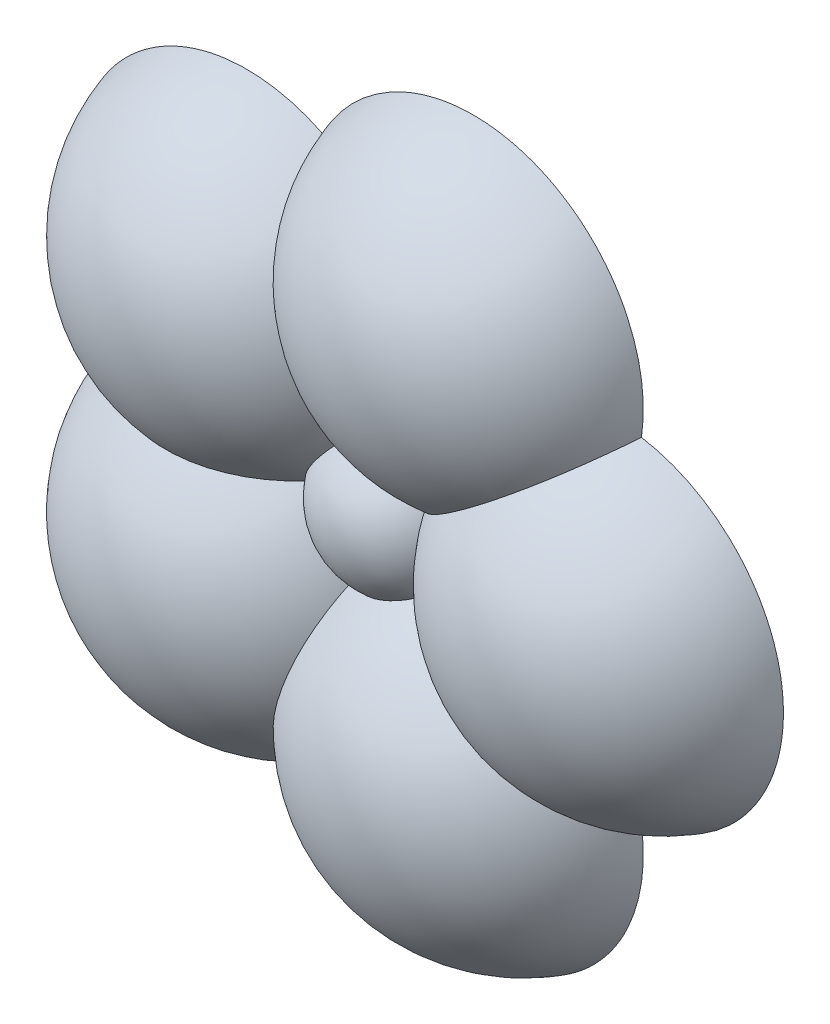
ISO-10303-21;
HEADER;
FILE_DESCRIPTION(('STEP AP214'),'2;1');
FILE_NAME('part.step','',(''),(''),'','','');
FILE_SCHEMA(('AUTOMOTIVE_DESIGN { 1 0 10303 214 1 1 1 1 }'));
ENDSEC;
DATA;
#1=APPLICATION_CONTEXT('core data for automotive mechanical design processes');
#2=APPLICATION_PROTOCOL_DEFINITION('international standard','automotive_design',2000,#1);
#3=PRODUCT_CONTEXT('',#1,'mechanical');
#4=PRODUCT('Part','Part','',(#3));
#5=PRODUCT_RELATED_PRODUCT_CATEGORY('part','',(#4));
#6=PRODUCT_DEFINITION_FORMATION('','',#4);
#7=PRODUCT_DEFINITION_CONTEXT('part definition',#1,'design');
#8=PRODUCT_DEFINITION('design','',#6,#7);
#9=PRODUCT_DEFINITION_SHAPE('','',#8);
#10=(LENGTH_UNIT() NAMED_UNIT(*) SI_UNIT(.MILLI.,.METRE.));
#11=(NAMED_UNIT(*) PLANE_ANGLE_UNIT() SI_UNIT($,.RADIAN.));
#12=(NAMED_UNIT(*) SI_UNIT($,.STERADIAN.) SOLID_ANGLE_UNIT());
#13=UNCERTAINTY_MEASURE_WITH_UNIT(LENGTH_MEASURE(1.E-05),#10,'distance_accuracy_value','');
#14=(GEOMETRIC_REPRESENTATION_CONTEXT(3) GLOBAL_UNCERTAINTY_ASSIGNED_CONTEXT((#13)) GLOBAL_UNIT_ASSIGNED_CONTEXT((#10,
#11,#12)) REPRESENTATION_CONTEXT('',''));
#15=CARTESIAN_POINT('',(0.,0.,0.));
#16=DIRECTION('',(0.,0.,1.));
#17=DIRECTION('',(1.,0.,0.));
#18=AXIS2_PLACEMENT_3D('',#15,#16,#17);
#19=CARTESIAN_POINT('',(0.,0.,1.));
#20=DIRECTION('',(1.,0.,0.));
#21=DIRECTION('',(0.,1.,0.));
#22=AXIS2_PLACEMENT_3D('',#19,#20,#21);
#23=SPHERICAL_SURFACE('',#22,1.5);
#24=CARTESIAN_POINT('',(0.823529411764706,0.,0.794117647058824));
#25=DIRECTION('',(-0.970142500145332,0.,0.242535625036333));
#26=DIRECTION('',(0.242535625036333,0.,0.970142500145332));
#27=AXIS2_PLACEMENT_3D('',#24,#25,#26);
#28=CIRCLE('',#27,1.23669388480169);
#29=CARTESIAN_POINT('',(1.05843313016408,0.76899668211404,1.73373252065632));
#30=VERTEX_POINT('',#29);
#31=CARTESIAN_POINT('',(1.05843313016408,-0.768996682114029,1.73373252065632));
#32=VERTEX_POINT('',#31);
#33=EDGE_CURVE('E178',#30,#32,#28,.F.);
#34=ORIENTED_EDGE('',*,*,#33,.F.);
#35=CARTESIAN_POINT('',(0.254484583602896,0.783223013419539,0.794117647058823));
#36=DIRECTION('',(-0.299790519510305,-0.922660346498091,0.242535625036333));
#37=DIRECTION('',(0.951056516295155,-0.309016994374945,0.));
#38=AXIS2_PLACEMENT_3D('',#35,#36,#37);
#39=CIRCLE('',#38,1.23669388480168);
#40=CARTESIAN_POINT('',(-0.404285480903742,1.24426276889641,1.73373252065632));
#41=VERTEX_POINT('',#40);
#42=EDGE_CURVE('E182',#41,#30,#39,.F.);
#43=ORIENTED_EDGE('',*,*,#42,.F.);
#44=CARTESIAN_POINT('',(-0.666249289485254,0.484058443064386,0.794117647058823));
#45=DIRECTION('',(0.784861769582977,-0.57023545420757,0.242535625036333));
#46=DIRECTION('',(0.587785252292468,0.809016994374951,0.));
#47=AXIS2_PLACEMENT_3D('',#44,#45,#46);
#48=CIRCLE('',#47,1.23669388480168);
#49=CARTESIAN_POINT('',(-1.30829529852069,0.,1.73373252065632));
#50=VERTEX_POINT('',#49);
#51=EDGE_CURVE('E186',#50,#41,#48,.F.);
#52=ORIENTED_EDGE('',*,*,#51,.F.);
#53=CARTESIAN_POINT('',(-0.666249289485247,-0.484058443064396,0.794117647058823));
#54=DIRECTION('',(0.784861769582968,0.570235454207581,0.242535625036333));
#55=DIRECTION('',(-0.58778525229248,0.809016994374942,0.));
#56=AXIS2_PLACEMENT_3D('',#53,#54,#55);
#57=CIRCLE('',#56,1.23669388480168);
#58=CARTESIAN_POINT('',(-0.404285480903724,-1.24426276889642,1.73373252065632));
#59=VERTEX_POINT('',#58);
#60=EDGE_CURVE('E69',#59,#50,#57,.F.);
#61=ORIENTED_EDGE('',*,*,#60,.F.);
#62=CARTESIAN_POINT('',(0.254484583602907,-0.783223013419535,0.794117647058823));
#63=DIRECTION('',(-0.299790519510318,0.922660346498086,0.242535625036333));
#64=DIRECTION('',(-0.95105651629515,-0.309016994374958,0.));
#65=AXIS2_PLACEMENT_3D('',#62,#63,#64);
#66=CIRCLE('',#65,1.23669388480168);
#67=EDGE_CURVE('E192',#32,#59,#66,.F.);
#68=ORIENTED_EDGE('',*,*,#67,.F.);
#69=EDGE_LOOP('',(#34,#43,#52,#61,#68));
#70=FACE_BOUND('',#69,.T.);
#71=ADVANCED_FACE('F52',(#70),#23,.T.);
#72=CARTESIAN_POINT('',(4.,0.,0.));
#73=DIRECTION('',(1.,0.,0.));
#74=DIRECTION('',(0.,-1.,0.));
#75=AXIS2_PLACEMENT_3D('',#72,#73,#74);
#76=SPHERICAL_SURFACE('',#75,3.5);
#77=CARTESIAN_POINT('',(2.61803398874989,1.90211303259031,0.));
#78=DIRECTION('',(-0.587785252292474,0.809016994374947,0.));
#79=DIRECTION('',(-0.809016994374947,-0.587785252292474,0.));
#80=AXIS2_PLACEMENT_3D('',#77,#78,#79);
#81=CIRCLE('',#80,2.59270822789599);
#82=CARTESIAN_POINT('',(4.55328244944148,3.30815334153966,1.));
#83=VERTEX_POINT('',#82);
#84=EDGE_CURVE('E161',#30,#83,#81,.T.);
#85=ORIENTED_EDGE('',*,*,#84,.F.);
#86=ORIENTED_EDGE('',*,*,#33,.T.);
#87=CARTESIAN_POINT('',(2.61803398874992,-1.9021130325903,0.));
#88=DIRECTION('',(-0.587785252292468,-0.809016994374951,0.));
#89=DIRECTION('',(0.809016994374951,-0.587785252292468,0.));
#90=AXIS2_PLACEMENT_3D('',#87,#88,#89);
#91=CIRCLE('',#90,2.59270822789601);
#92=CARTESIAN_POINT('',(4.55328244944153,-3.30815334153965,1.));
#93=VERTEX_POINT('',#92);
#94=EDGE_CURVE('E149',#93,#32,#91,.T.);
#95=ORIENTED_EDGE('',*,*,#94,.F.);
#96=CARTESIAN_POINT('',(4.,0.,1.));
#97=DIRECTION('',(0.,0.,1.));
#98=DIRECTION('',(1.,0.,0.));
#99=AXIS2_PLACEMENT_3D('',#96,#97,#98);
#100=CIRCLE('',#99,3.35410196624968);
#101=EDGE_CURVE('E77',#83,#93,#100,.F.);
#102=ORIENTED_EDGE('',*,*,#101,.F.);
#103=EDGE_LOOP('',(#85,#86,#95,#102));
#104=FACE_BOUND('',#103,.T.);
#105=ADVANCED_FACE('F54',(#104),#76,.T.);
#106=CARTESIAN_POINT('',(1.23606797749978,3.80422606518062,0.));
#107=DIRECTION('',(0.309016994374945,0.951056516295155,0.));
#108=DIRECTION('',(0.951056516295155,-0.309016994374945,0.));
#109=AXIS2_PLACEMENT_3D('',#106,#107,#108);
#110=SPHERICAL_SURFACE('',#109,3.5);
#111=CARTESIAN_POINT('',(-1.00000000000001,3.07768353717525,0.));
#112=DIRECTION('',(-0.951056516295152,-0.309016994374952,0.));
#113=DIRECTION('',(0.309016994374952,-0.951056516295152,0.));
#114=AXIS2_PLACEMENT_3D('',#111,#112,#113);
#115=CIRCLE('',#114,2.59270822789599);
#116=CARTESIAN_POINT('',(-1.73919913530829,5.3527045466077,1.));
#117=VERTEX_POINT('',#116);
#118=EDGE_CURVE('E158',#41,#117,#115,.T.);
#119=ORIENTED_EDGE('',*,*,#118,.F.);
#120=ORIENTED_EDGE('',*,*,#42,.T.);
#121=ORIENTED_EDGE('',*,*,#84,.T.);
#122=CARTESIAN_POINT('',(1.23606797749978,3.80422606518062,1.));
#123=DIRECTION('',(0.,0.,1.));
#124=DIRECTION('',(1.,0.,0.));
#125=AXIS2_PLACEMENT_3D('',#122,#123,#124);
#126=CIRCLE('',#125,3.35410196624968);
#127=EDGE_CURVE('E168',#117,#83,#126,.F.);
#128=ORIENTED_EDGE('',*,*,#127,.F.);
#129=EDGE_LOOP('',(#119,#120,#121,#128));
#130=FACE_BOUND('',#129,.T.);
#131=ADVANCED_FACE('F229',(#130),#110,.T.);
#132=CARTESIAN_POINT('',(-3.2360679774998,2.35114100916987,0.));
#133=DIRECTION('',(-0.809016994374951,0.587785252292469,0.));
#134=DIRECTION('',(0.587785252292469,0.809016994374951,0.));
#135=AXIS2_PLACEMENT_3D('',#132,#133,#134);
#136=SPHERICAL_SURFACE('',#135,3.5);
#137=CARTESIAN_POINT('',(-3.23606797749979,0.,0.));
#138=DIRECTION('',(0.,-1.,0.));
#139=DIRECTION('',(1.,0.,0.));
#140=AXIS2_PLACEMENT_3D('',#137,#138,#139);
#141=CIRCLE('',#140,2.59270822789599);
#142=CARTESIAN_POINT('',(-5.62816662826642,0.,1.));
#143=VERTEX_POINT('',#142);
#144=EDGE_CURVE('E155',#50,#143,#141,.T.);
#145=ORIENTED_EDGE('',*,*,#144,.F.);
#146=ORIENTED_EDGE('',*,*,#51,.T.);
#147=ORIENTED_EDGE('',*,*,#118,.T.);
#148=CARTESIAN_POINT('',(-3.2360679774998,2.35114100916987,1.));
#149=DIRECTION('',(0.,0.,1.));
#150=DIRECTION('',(1.,0.,0.));
#151=AXIS2_PLACEMENT_3D('',#148,#149,#150);
#152=CIRCLE('',#151,3.35410196624968);
#153=EDGE_CURVE('E171',#143,#117,#152,.F.);
#154=ORIENTED_EDGE('',*,*,#153,.F.);
#155=EDGE_LOOP('',(#145,#146,#147,#154));
#156=FACE_BOUND('',#155,.T.);
#157=ADVANCED_FACE('F293',(#156),#136,.T.);
#158=CARTESIAN_POINT('',(-3.23606797749977,-2.35114100916992,0.));
#159=DIRECTION('',(-0.809016994374942,-0.58778525229248,0.));
#160=DIRECTION('',(-0.58778525229248,0.809016994374942,0.));
#161=AXIS2_PLACEMENT_3D('',#158,#159,#160);
#162=SPHERICAL_SURFACE('',#161,3.5);
#163=CARTESIAN_POINT('',(-0.999999999999967,-3.07768353717526,0.));
#164=DIRECTION('',(0.951056516295157,-0.309016994374938,0.));
#165=DIRECTION('',(0.309016994374938,0.951056516295157,0.));
#166=AXIS2_PLACEMENT_3D('',#163,#164,#165);
#167=CIRCLE('',#166,2.59270822789599);
#168=CARTESIAN_POINT('',(-1.73919913530822,-5.35270454660772,1.));
#169=VERTEX_POINT('',#168);
#170=EDGE_CURVE('E152',#59,#169,#167,.T.);
#171=ORIENTED_EDGE('',*,*,#170,.F.);
#172=ORIENTED_EDGE('',*,*,#60,.T.);
#173=ORIENTED_EDGE('',*,*,#144,.T.);
#174=CARTESIAN_POINT('',(-3.23606797749977,-2.35114100916992,1.));
#175=DIRECTION('',(0.,0.,1.));
#176=DIRECTION('',(1.,0.,0.));
#177=AXIS2_PLACEMENT_3D('',#174,#175,#176);
#178=CIRCLE('',#177,3.35410196624968);
#179=EDGE_CURVE('E175',#169,#143,#178,.F.);
#180=ORIENTED_EDGE('',*,*,#179,.F.);
#181=EDGE_LOOP('',(#171,#172,#173,#180));
#182=FACE_BOUND('',#181,.T.);
#183=ADVANCED_FACE('F222',(#182),#162,.T.);
#184=CARTESIAN_POINT('',(1.23606797749983,-3.8042260651806,0.));
#185=DIRECTION('',(0.309016994374958,-0.95105651629515,0.));
#186=DIRECTION('',(-0.95105651629515,-0.309016994374958,0.));
#187=AXIS2_PLACEMENT_3D('',#184,#185,#186);
#188=SPHERICAL_SURFACE('',#187,3.5);
#189=ORIENTED_EDGE('',*,*,#94,.T.);
#190=ORIENTED_EDGE('',*,*,#67,.T.);
#191=ORIENTED_EDGE('',*,*,#170,.T.);
#192=CARTESIAN_POINT('',(1.23606797749983,-3.8042260651806,1.));
#193=DIRECTION('',(0.,0.,1.));
#194=DIRECTION('',(1.,0.,0.));
#195=AXIS2_PLACEMENT_3D('',#192,#193,#194);
#196=CIRCLE('',#195,3.35410196624968);
#197=EDGE_CURVE('E142',#93,#169,#196,.F.);
#198=ORIENTED_EDGE('',*,*,#197,.F.);
#199=EDGE_LOOP('',(#189,#190,#191,#198));
#200=FACE_BOUND('',#199,.T.);
#201=ADVANCED_FACE('F216',(#200),#188,.T.);
#202=CARTESIAN_POINT('',(0.,0.,1.));
#203=DIRECTION('',(0.,0.,1.));
#204=DIRECTION('',(1.,0.,0.));
#205=AXIS2_PLACEMENT_3D('',#202,#203,#204);
#206=PLANE('',#205);
#207=CARTESIAN_POINT('',(0.,0.,1.));
#208=DIRECTION('',(0.,0.,1.));
#209=DIRECTION('',(1.,0.,0.));
#210=AXIS2_PLACEMENT_3D('',#207,#208,#209);
#211=CIRCLE('',#210,1.25);
#212=CARTESIAN_POINT('',(1.25,0.,1.));
#213=VERTEX_POINT('',#212);
#214=EDGE_CURVE('E11',#213,#213,#211,.F.);
#215=ORIENTED_EDGE('',*,*,#214,.F.);
#216=EDGE_LOOP('',(#215));
#217=FACE_BOUND('',#216,.T.);
#218=ORIENTED_EDGE('',*,*,#101,.T.);
#219=ORIENTED_EDGE('',*,*,#197,.T.);
#220=ORIENTED_EDGE('',*,*,#179,.T.);
#221=ORIENTED_EDGE('',*,*,#153,.T.);
#222=ORIENTED_EDGE('',*,*,#127,.T.);
#223=EDGE_LOOP('',(#218,#219,#220,#221,#222));
#224=FACE_BOUND('',#223,.T.);
#225=ADVANCED_FACE('F214',(#217,#224),#206,.F.);
#226=CARTESIAN_POINT('',(0.,0.,-2.));
#227=DIRECTION('',(0.,0.,-1.));
#228=DIRECTION('',(-1.,0.,0.));
#229=AXIS2_PLACEMENT_3D('',#226,#227,#228);
#230=PLANE('',#229);
#231=CARTESIAN_POINT('',(0.,0.,-2.));
#232=DIRECTION('',(0.,0.,-1.));
#233=DIRECTION('',(-1.,0.,0.));
#234=AXIS2_PLACEMENT_3D('',#231,#232,#233);
#235=CIRCLE('',#234,1.25);
#236=CARTESIAN_POINT('',(-1.25,0.,-2.));
#237=VERTEX_POINT('',#236);
#238=EDGE_CURVE('E138',#237,#237,#235,.T.);
#239=ORIENTED_EDGE('',*,*,#238,.T.);
#240=EDGE_LOOP('',(#239));
#241=FACE_BOUND('',#240,.T.);
#242=ADVANCED_FACE('F206',(#241),#230,.T.);
#243=CARTESIAN_POINT('',(0.,0.,-2.));
#244=DIRECTION('',(0.,0.,1.));
#245=DIRECTION('',(1.,0.,0.));
#246=AXIS2_PLACEMENT_3D('',#243,#244,#245);
#247=CYLINDRICAL_SURFACE('',#246,1.25);
#248=ORIENTED_EDGE('',*,*,#238,.F.);
#249=EDGE_LOOP('',(#248));
#250=FACE_BOUND('',#249,.T.);
#251=ORIENTED_EDGE('',*,*,#214,.T.);
#252=EDGE_LOOP('',(#251));
#253=FACE_BOUND('',#252,.T.);
#254=ADVANCED_FACE('F208',(#250,#253),#247,.T.);
#255=CLOSED_SHELL('',(#71,#105,#131,#157,#183,#201,#225,#242,#254));
#256=CARTESIAN_POINT('',(0.,0.,1.));
#257=DIRECTION('',(0.,0.,-1.));
#258=DIRECTION('',(-1.,0.,0.));
#259=AXIS2_PLACEMENT_3D('',#256,#257,#258);
#260=PLANE('',#259);
#261=CARTESIAN_POINT('',(1.23606797749978,-3.80422606518062,1.));
#262=DIRECTION('',(0.,0.,-1.));
#263=DIRECTION('',(-1.,0.,0.));
#264=AXIS2_PLACEMENT_3D('',#261,#262,#263);
#265=CIRCLE('',#264,3.35410196624968);
#266=CARTESIAN_POINT('',(-0.26080086469173,-0.802662527742796,1.));
#267=VERTEX_POINT('',#266);
#268=CARTESIAN_POINT('',(0.6827855280583,-0.496072723640956,1.));
#269=VERTEX_POINT('',#268);
#270=EDGE_CURVE('E131',#267,#269,#265,.T.);
#271=ORIENTED_EDGE('',*,*,#270,.T.);
#272=CARTESIAN_POINT('',(4.,0.,1.));
#273=DIRECTION('',(0.,0.,-1.));
#274=DIRECTION('',(-1.,0.,0.));
#275=AXIS2_PLACEMENT_3D('',#272,#273,#274);
#276=CIRCLE('',#275,3.35410196624968);
#277=CARTESIAN_POINT('',(0.6827855280583,0.496072723640956,1.));
#278=VERTEX_POINT('',#277);
#279=EDGE_CURVE('E127',#269,#278,#276,.T.);
#280=ORIENTED_EDGE('',*,*,#279,.T.);
#281=CARTESIAN_POINT('',(1.23606797749978,3.80422606518062,1.));
#282=DIRECTION('',(0.,0.,-1.));
#283=DIRECTION('',(-1.,0.,0.));
#284=AXIS2_PLACEMENT_3D('',#281,#282,#283);
#285=CIRCLE('',#284,3.35410196624968);
#286=CARTESIAN_POINT('',(-0.26080086469173,0.802662527742796,1.));
#287=VERTEX_POINT('',#286);
#288=EDGE_CURVE('E137',#278,#287,#285,.T.);
#289=ORIENTED_EDGE('',*,*,#288,.T.);
#290=CARTESIAN_POINT('',(-3.2360679774998,2.35114100916987,1.));
#291=DIRECTION('',(0.,0.,-1.));
#292=DIRECTION('',(-1.,0.,0.));
#293=AXIS2_PLACEMENT_3D('',#290,#291,#292);
#294=CIRCLE('',#293,3.35410196624968);
#295=CARTESIAN_POINT('',(-0.843969326733152,0.,1.));
#296=VERTEX_POINT('',#295);
#297=EDGE_CURVE('E62',#287,#296,#294,.T.);
#298=ORIENTED_EDGE('',*,*,#297,.T.);
#299=CARTESIAN_POINT('',(-3.2360679774998,-2.35114100916987,1.));
#300=DIRECTION('',(0.,0.,-1.));
#301=DIRECTION('',(-1.,0.,0.));
#302=AXIS2_PLACEMENT_3D('',#299,#300,#301);
#303=CIRCLE('',#302,3.35410196624968);
#304=EDGE_CURVE('E121',#296,#267,#303,.T.);
#305=ORIENTED_EDGE('',*,*,#304,.T.);
#306=EDGE_LOOP('',(#271,#280,#289,#298,#305));
#307=FACE_BOUND('',#306,.T.);
#308=ADVANCED_FACE('F140',(#307),#260,.F.);
#309=CARTESIAN_POINT('',(-3.2360679774998,0.,-1.35114100916987));
#310=DIRECTION('',(0.,-1.,0.));
#311=DIRECTION('',(0.,0.,-1.));
#312=AXIS2_PLACEMENT_3D('',#309,#310,#311);
#313=CIRCLE('',#312,3.35410196624968);
#314=TRIMMED_CURVE('',#313,(PARAMETER_VALUE(-2.34755975389135)),
(PARAMETER_VALUE(2.34755975389135)),.T.,.PARAMETER.);
#315=CARTESIAN_POINT('',(-3.2360679774998,0.,1.));
#316=DIRECTION('',(1.,0.,0.));
#317=AXIS1_PLACEMENT('',#315,#316);
#318=SURFACE_OF_REVOLUTION('',#314,#317);
#319=ORIENTED_EDGE('',*,*,#297,.F.);
#320=CARTESIAN_POINT('',(-0.26080086469173,0.,1.));
#321=DIRECTION('',(1.,0.,0.));
#322=DIRECTION('',(0.,0.,-1.));
#323=AXIS2_PLACEMENT_3D('',#320,#321,#322);
#324=CIRCLE('',#323,0.802662527742796);
#325=EDGE_CURVE('E117',#287,#267,#324,.T.);
#326=ORIENTED_EDGE('',*,*,#325,.T.);
#327=ORIENTED_EDGE('',*,*,#304,.F.);
#328=EDGE_LOOP('',(#319,#326,#327));
#329=FACE_BOUND('',#328,.T.);
#330=ADVANCED_FACE('F119',(#329),#318,.T.);
#331=CARTESIAN_POINT('',(1.23606797749978,0.,1.));
#332=DIRECTION('',(1.,0.,0.));
#333=DIRECTION('',(0.,0.,-1.));
#334=AXIS2_PLACEMENT_3D('',#331,#332,#333);
#335=TOROIDAL_SURFACE('',#334,3.80422606518062,3.35410196624968);
#336=ORIENTED_EDGE('',*,*,#288,.F.);
#337=CARTESIAN_POINT('',(0.6827855280583,0.,1.));
#338=DIRECTION('',(1.,0.,0.));
#339=DIRECTION('',(0.,0.,-1.));
#340=AXIS2_PLACEMENT_3D('',#337,#338,#339);
#341=CIRCLE('',#340,0.496072723640956);
#342=EDGE_CURVE('E126',#278,#269,#341,.T.);
#343=ORIENTED_EDGE('',*,*,#342,.T.);
#344=ORIENTED_EDGE('',*,*,#270,.F.);
#345=ORIENTED_EDGE('',*,*,#325,.F.);
#346=EDGE_LOOP('',(#336,#343,#344,#345));
#347=FACE_BOUND('',#346,.T.);
#348=ADVANCED_FACE('F132',(#347),#335,.T.);
#349=CARTESIAN_POINT('',(4.,0.,1.));
#350=DIRECTION('',(1.,0.,0.));
#351=DIRECTION('',(0.,1.,0.));
#352=AXIS2_PLACEMENT_3D('',#349,#350,#351);
#353=SPHERICAL_SURFACE('',#352,3.35410196624968);
#354=ORIENTED_EDGE('',*,*,#279,.F.);
#355=ORIENTED_EDGE('',*,*,#342,.F.);
#356=EDGE_LOOP('',(#354,#355));
#357=FACE_BOUND('',#356,.T.);
#358=ADVANCED_FACE('F232',(#357),#353,.T.);
#359=CLOSED_SHELL('',(#308,#330,#348,#358));
#360=ORIENTED_CLOSED_SHELL('',*,#359,.T.);
#361=BREP_WITH_VOIDS('B2',#255,(#360));
#362=ADVANCED_BREP_SHAPE_REPRESENTATION('',(#18,#361),#14);
#363=SHAPE_DEFINITION_REPRESENTATION(#9,#362);
ENDSEC;
END-ISO-10303-21;
